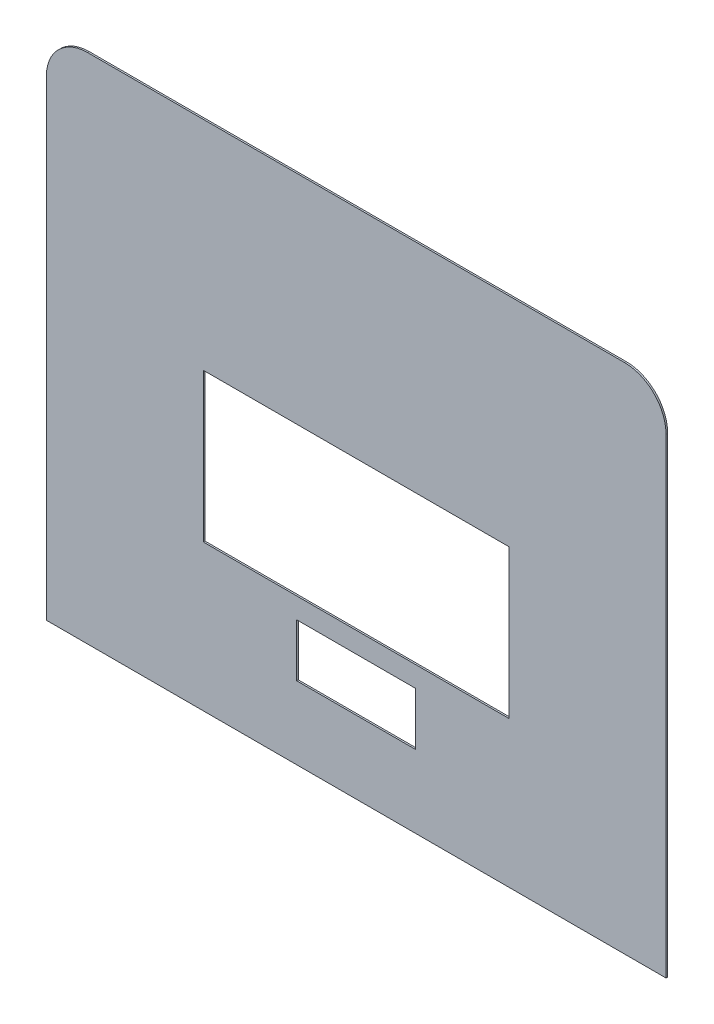
ISO-10303-21;
HEADER;
FILE_DESCRIPTION(('STEP AP214'),'2;1');
FILE_NAME('part.step','',(''),(''),'','','');
FILE_SCHEMA(('AUTOMOTIVE_DESIGN { 1 0 10303 214 1 1 1 1 }'));
ENDSEC;
DATA;
#1=APPLICATION_CONTEXT('core data for automotive mechanical design processes');
#2=APPLICATION_PROTOCOL_DEFINITION('international standard','automotive_design',2000,#1);
#3=PRODUCT_CONTEXT('',#1,'mechanical');
#4=PRODUCT('Part','Part','',(#3));
#5=PRODUCT_RELATED_PRODUCT_CATEGORY('part','',(#4));
#6=PRODUCT_DEFINITION_FORMATION('','',#4);
#7=PRODUCT_DEFINITION_CONTEXT('part definition',#1,'design');
#8=PRODUCT_DEFINITION('design','',#6,#7);
#9=PRODUCT_DEFINITION_SHAPE('','',#8);
#10=(LENGTH_UNIT() NAMED_UNIT(*) SI_UNIT(.MILLI.,.METRE.));
#11=(NAMED_UNIT(*) PLANE_ANGLE_UNIT() SI_UNIT($,.RADIAN.));
#12=(NAMED_UNIT(*) SI_UNIT($,.STERADIAN.) SOLID_ANGLE_UNIT());
#13=UNCERTAINTY_MEASURE_WITH_UNIT(LENGTH_MEASURE(1.E-05),#10,'distance_accuracy_value','');
#14=(GEOMETRIC_REPRESENTATION_CONTEXT(3) GLOBAL_UNCERTAINTY_ASSIGNED_CONTEXT((#13)) GLOBAL_UNIT_ASSIGNED_CONTEXT((#10,
#11,#12)) REPRESENTATION_CONTEXT('',''));
#15=CARTESIAN_POINT('',(0.,0.,0.));
#16=DIRECTION('',(0.,0.,1.));
#17=DIRECTION('',(1.,0.,0.));
#18=AXIS2_PLACEMENT_3D('',#15,#16,#17);
#19=CARTESIAN_POINT('',(-325.,260.,1.));
#20=DIRECTION('',(0.,0.,1.));
#21=DIRECTION('',(1.,0.,0.));
#22=AXIS2_PLACEMENT_3D('',#19,#20,#21);
#23=PLANE('',#22);
#24=DIRECTION('',(0.,1.,0.));
#25=VECTOR('',#24,1.);
#26=CARTESIAN_POINT('',(375.,260.,1.));
#27=LINE('',#26,#25);
#28=CARTESIAN_POINT('',(375.,-310.,1.));
#29=VERTEX_POINT('',#28);
#30=CARTESIAN_POINT('',(375.,260.,1.));
#31=VERTEX_POINT('',#30);
#32=EDGE_CURVE('E203',#29,#31,#27,.T.);
#33=ORIENTED_EDGE('',*,*,#32,.T.);
#34=CARTESIAN_POINT('',(325.,260.,1.));
#35=DIRECTION('',(0.,0.,1.));
#36=DIRECTION('',(-1.,0.,0.));
#37=AXIS2_PLACEMENT_3D('',#34,#35,#36);
#38=CIRCLE('',#37,50.);
#39=CARTESIAN_POINT('',(325.,310.,1.));
#40=VERTEX_POINT('',#39);
#41=EDGE_CURVE('E206',#31,#40,#38,.T.);
#42=ORIENTED_EDGE('',*,*,#41,.T.);
#43=DIRECTION('',(-1.,0.,0.));
#44=VECTOR('',#43,1.);
#45=CARTESIAN_POINT('',(-325.,310.,1.));
#46=LINE('',#45,#44);
#47=CARTESIAN_POINT('',(-325.,310.,1.));
#48=VERTEX_POINT('',#47);
#49=EDGE_CURVE('E209',#40,#48,#46,.T.);
#50=ORIENTED_EDGE('',*,*,#49,.T.);
#51=CARTESIAN_POINT('',(-325.,260.,1.));
#52=DIRECTION('',(0.,0.,1.));
#53=DIRECTION('',(1.,0.,0.));
#54=AXIS2_PLACEMENT_3D('',#51,#52,#53);
#55=CIRCLE('',#54,50.);
#56=CARTESIAN_POINT('',(-375.,260.,1.));
#57=VERTEX_POINT('',#56);
#58=EDGE_CURVE('E211',#48,#57,#55,.T.);
#59=ORIENTED_EDGE('',*,*,#58,.T.);
#60=DIRECTION('',(0.,-1.,0.));
#61=VECTOR('',#60,1.);
#62=CARTESIAN_POINT('',(-375.,260.,1.));
#63=LINE('',#62,#61);
#64=CARTESIAN_POINT('',(-375.,-310.,1.));
#65=VERTEX_POINT('',#64);
#66=EDGE_CURVE('E213',#57,#65,#63,.T.);
#67=ORIENTED_EDGE('',*,*,#66,.T.);
#68=DIRECTION('',(1.,0.,0.));
#69=VECTOR('',#68,1.);
#70=CARTESIAN_POINT('',(-375.,-310.,1.));
#71=LINE('',#70,#69);
#72=EDGE_CURVE('E215',#65,#29,#71,.T.);
#73=ORIENTED_EDGE('',*,*,#72,.T.);
#74=EDGE_LOOP('',(#33,#42,#50,#59,#67,#73));
#75=FACE_BOUND('',#74,.T.);
#76=DIRECTION('',(-1.,0.,0.));
#77=VECTOR('',#76,1.);
#78=CARTESIAN_POINT('',(-71.9999999999999,-158.,1.));
#79=LINE('',#78,#77);
#80=CARTESIAN_POINT('',(72.0000000000001,-158.,1.));
#81=VERTEX_POINT('',#80);
#82=CARTESIAN_POINT('',(-71.9999999999999,-158.,1.));
#83=VERTEX_POINT('',#82);
#84=EDGE_CURVE('E174',#81,#83,#79,.T.);
#85=ORIENTED_EDGE('',*,*,#84,.F.);
#86=DIRECTION('',(0.,1.,0.));
#87=VECTOR('',#86,1.);
#88=CARTESIAN_POINT('',(72.0000000000001,-158.,1.));
#89=LINE('',#88,#87);
#90=CARTESIAN_POINT('',(72.0000000000001,-222.,1.));
#91=VERTEX_POINT('',#90);
#92=EDGE_CURVE('E172',#91,#81,#89,.T.);
#93=ORIENTED_EDGE('',*,*,#92,.F.);
#94=DIRECTION('',(1.,0.,0.));
#95=VECTOR('',#94,1.);
#96=CARTESIAN_POINT('',(-71.9999999999999,-222.,1.));
#97=LINE('',#96,#95);
#98=CARTESIAN_POINT('',(-72.,-222.,1.));
#99=VERTEX_POINT('',#98);
#100=EDGE_CURVE('E180',#99,#91,#97,.T.);
#101=ORIENTED_EDGE('',*,*,#100,.F.);
#102=DIRECTION('',(0.,-1.,0.));
#103=VECTOR('',#102,1.);
#104=CARTESIAN_POINT('',(-71.9999999999999,-158.,1.));
#105=LINE('',#104,#103);
#106=EDGE_CURVE('E177',#83,#99,#105,.T.);
#107=ORIENTED_EDGE('',*,*,#106,.F.);
#108=EDGE_LOOP('',(#85,#93,#101,#107));
#109=FACE_BOUND('',#108,.T.);
#110=DIRECTION('',(-1.,0.,0.));
#111=VECTOR('',#110,1.);
#112=CARTESIAN_POINT('',(-185.,47.,1.));
#113=LINE('',#112,#111);
#114=CARTESIAN_POINT('',(185.,47.,1.));
#115=VERTEX_POINT('',#114);
#116=CARTESIAN_POINT('',(-185.,47.,1.));
#117=VERTEX_POINT('',#116);
#118=EDGE_CURVE('E144',#115,#117,#113,.T.);
#119=ORIENTED_EDGE('',*,*,#118,.F.);
#120=DIRECTION('',(0.,1.,0.));
#121=VECTOR('',#120,1.);
#122=CARTESIAN_POINT('',(185.,47.,1.));
#123=LINE('',#122,#121);
#124=CARTESIAN_POINT('',(185.,-133.,1.));
#125=VERTEX_POINT('',#124);
#126=EDGE_CURVE('E136',#125,#115,#123,.T.);
#127=ORIENTED_EDGE('',*,*,#126,.F.);
#128=DIRECTION('',(1.,0.,0.));
#129=VECTOR('',#128,1.);
#130=CARTESIAN_POINT('',(-185.,-133.,1.));
#131=LINE('',#130,#129);
#132=CARTESIAN_POINT('',(-185.,-133.,1.));
#133=VERTEX_POINT('',#132);
#134=EDGE_CURVE('E158',#133,#125,#131,.T.);
#135=ORIENTED_EDGE('',*,*,#134,.F.);
#136=DIRECTION('',(0.,-1.,0.));
#137=VECTOR('',#136,1.);
#138=CARTESIAN_POINT('',(-185.,47.,1.));
#139=LINE('',#138,#137);
#140=EDGE_CURVE('E156',#117,#133,#139,.T.);
#141=ORIENTED_EDGE('',*,*,#140,.F.);
#142=EDGE_LOOP('',(#119,#127,#135,#141));
#143=FACE_BOUND('',#142,.T.);
#144=ADVANCED_FACE('F35',(#75,#109,#143),#23,.T.);
#145=CARTESIAN_POINT('',(-325.,260.,-1.));
#146=DIRECTION('',(0.,0.,1.));
#147=DIRECTION('',(1.,0.,0.));
#148=AXIS2_PLACEMENT_3D('',#145,#146,#147);
#149=PLANE('',#148);
#150=DIRECTION('',(0.,1.,0.));
#151=VECTOR('',#150,1.);
#152=CARTESIAN_POINT('',(72.0000000000001,-158.,-1.));
#153=LINE('',#152,#151);
#154=CARTESIAN_POINT('',(72.0000000000001,-222.,-1.));
#155=VERTEX_POINT('',#154);
#156=CARTESIAN_POINT('',(72.0000000000001,-158.,-1.));
#157=VERTEX_POINT('',#156);
#158=EDGE_CURVE('E152',#155,#157,#153,.T.);
#159=ORIENTED_EDGE('',*,*,#158,.T.);
#160=DIRECTION('',(-1.,0.,0.));
#161=VECTOR('',#160,1.);
#162=CARTESIAN_POINT('',(-71.9999999999999,-158.,-1.));
#163=LINE('',#162,#161);
#164=CARTESIAN_POINT('',(-71.9999999999999,-158.,-1.));
#165=VERTEX_POINT('',#164);
#166=EDGE_CURVE('E185',#157,#165,#163,.T.);
#167=ORIENTED_EDGE('',*,*,#166,.T.);
#168=DIRECTION('',(0.,-1.,0.));
#169=VECTOR('',#168,1.);
#170=CARTESIAN_POINT('',(-71.9999999999999,-158.,-1.));
#171=LINE('',#170,#169);
#172=CARTESIAN_POINT('',(-71.9999999999999,-222.,-1.));
#173=VERTEX_POINT('',#172);
#174=EDGE_CURVE('E188',#165,#173,#171,.T.);
#175=ORIENTED_EDGE('',*,*,#174,.T.);
#176=DIRECTION('',(1.,0.,0.));
#177=VECTOR('',#176,1.);
#178=CARTESIAN_POINT('',(-71.9999999999999,-222.,-1.));
#179=LINE('',#178,#177);
#180=EDGE_CURVE('E175',#173,#155,#179,.T.);
#181=ORIENTED_EDGE('',*,*,#180,.T.);
#182=EDGE_LOOP('',(#159,#167,#175,#181));
#183=FACE_BOUND('',#182,.T.);
#184=DIRECTION('',(0.,1.,0.));
#185=VECTOR('',#184,1.);
#186=CARTESIAN_POINT('',(375.,260.,-1.));
#187=LINE('',#186,#185);
#188=CARTESIAN_POINT('',(375.,-310.,-1.));
#189=VERTEX_POINT('',#188);
#190=CARTESIAN_POINT('',(375.,260.,-1.));
#191=VERTEX_POINT('',#190);
#192=EDGE_CURVE('E202',#189,#191,#187,.T.);
#193=ORIENTED_EDGE('',*,*,#192,.F.);
#194=DIRECTION('',(1.,0.,0.));
#195=VECTOR('',#194,1.);
#196=CARTESIAN_POINT('',(-375.,-310.,-1.));
#197=LINE('',#196,#195);
#198=CARTESIAN_POINT('',(-375.,-310.,-1.));
#199=VERTEX_POINT('',#198);
#200=EDGE_CURVE('E207',#199,#189,#197,.T.);
#201=ORIENTED_EDGE('',*,*,#200,.F.);
#202=DIRECTION('',(0.,-1.,0.));
#203=VECTOR('',#202,1.);
#204=CARTESIAN_POINT('',(-375.,260.,-1.));
#205=LINE('',#204,#203);
#206=CARTESIAN_POINT('',(-375.,260.,-1.));
#207=VERTEX_POINT('',#206);
#208=EDGE_CURVE('E226',#207,#199,#205,.T.);
#209=ORIENTED_EDGE('',*,*,#208,.F.);
#210=CARTESIAN_POINT('',(-325.,260.,-1.));
#211=DIRECTION('',(0.,0.,1.));
#212=DIRECTION('',(1.,0.,0.));
#213=AXIS2_PLACEMENT_3D('',#210,#211,#212);
#214=CIRCLE('',#213,50.);
#215=CARTESIAN_POINT('',(-325.,310.,-1.));
#216=VERTEX_POINT('',#215);
#217=EDGE_CURVE('E224',#216,#207,#214,.T.);
#218=ORIENTED_EDGE('',*,*,#217,.F.);
#219=DIRECTION('',(-1.,0.,0.));
#220=VECTOR('',#219,1.);
#221=CARTESIAN_POINT('',(-325.,310.,-1.));
#222=LINE('',#221,#220);
#223=CARTESIAN_POINT('',(325.,310.,-1.));
#224=VERTEX_POINT('',#223);
#225=EDGE_CURVE('E222',#224,#216,#222,.T.);
#226=ORIENTED_EDGE('',*,*,#225,.F.);
#227=CARTESIAN_POINT('',(325.,260.,-1.));
#228=DIRECTION('',(0.,0.,1.));
#229=DIRECTION('',(-1.,0.,0.));
#230=AXIS2_PLACEMENT_3D('',#227,#228,#229);
#231=CIRCLE('',#230,50.);
#232=EDGE_CURVE('E220',#191,#224,#231,.T.);
#233=ORIENTED_EDGE('',*,*,#232,.F.);
#234=EDGE_LOOP('',(#193,#201,#209,#218,#226,#233));
#235=FACE_BOUND('',#234,.T.);
#236=DIRECTION('',(0.,1.,0.));
#237=VECTOR('',#236,1.);
#238=CARTESIAN_POINT('',(185.,47.,-1.));
#239=LINE('',#238,#237);
#240=CARTESIAN_POINT('',(185.,-133.,-1.));
#241=VERTEX_POINT('',#240);
#242=CARTESIAN_POINT('',(185.,47.,-1.));
#243=VERTEX_POINT('',#242);
#244=EDGE_CURVE('E58',#241,#243,#239,.T.);
#245=ORIENTED_EDGE('',*,*,#244,.T.);
#246=DIRECTION('',(-1.,0.,0.));
#247=VECTOR('',#246,1.);
#248=CARTESIAN_POINT('',(-185.,47.,-1.));
#249=LINE('',#248,#247);
#250=CARTESIAN_POINT('',(-185.,47.,-1.));
#251=VERTEX_POINT('',#250);
#252=EDGE_CURVE('E151',#243,#251,#249,.T.);
#253=ORIENTED_EDGE('',*,*,#252,.T.);
#254=DIRECTION('',(0.,-1.,0.));
#255=VECTOR('',#254,1.);
#256=CARTESIAN_POINT('',(-185.,47.,-1.));
#257=LINE('',#256,#255);
#258=CARTESIAN_POINT('',(-185.,-133.,-1.));
#259=VERTEX_POINT('',#258);
#260=EDGE_CURVE('E164',#251,#259,#257,.T.);
#261=ORIENTED_EDGE('',*,*,#260,.T.);
#262=DIRECTION('',(1.,0.,0.));
#263=VECTOR('',#262,1.);
#264=CARTESIAN_POINT('',(-185.,-133.,-1.));
#265=LINE('',#264,#263);
#266=EDGE_CURVE('E145',#259,#241,#265,.T.);
#267=ORIENTED_EDGE('',*,*,#266,.T.);
#268=EDGE_LOOP('',(#245,#253,#261,#267));
#269=FACE_BOUND('',#268,.T.);
#270=ADVANCED_FACE('F250',(#183,#235,#269),#149,.F.);
#271=CARTESIAN_POINT('',(375.,260.,1.));
#272=DIRECTION('',(-1.,0.,0.));
#273=DIRECTION('',(0.,-1.,0.));
#274=AXIS2_PLACEMENT_3D('',#271,#272,#273);
#275=PLANE('',#274);
#276=ORIENTED_EDGE('',*,*,#192,.T.);
#277=DIRECTION('',(0.,0.,-1.));
#278=VECTOR('',#277,1.);
#279=CARTESIAN_POINT('',(375.,260.,1.));
#280=LINE('',#279,#278);
#281=EDGE_CURVE('E11',#31,#191,#280,.T.);
#282=ORIENTED_EDGE('',*,*,#281,.F.);
#283=ORIENTED_EDGE('',*,*,#32,.F.);
#284=DIRECTION('',(0.,0.,-1.));
#285=VECTOR('',#284,1.);
#286=CARTESIAN_POINT('',(375.,-310.,1.));
#287=LINE('',#286,#285);
#288=EDGE_CURVE('E217',#29,#189,#287,.T.);
#289=ORIENTED_EDGE('',*,*,#288,.T.);
#290=EDGE_LOOP('',(#276,#282,#283,#289));
#291=FACE_BOUND('',#290,.T.);
#292=ADVANCED_FACE('F37',(#291),#275,.F.);
#293=CARTESIAN_POINT('',(325.,260.,1.));
#294=DIRECTION('',(0.,0.,-1.));
#295=DIRECTION('',(-1.,0.,0.));
#296=AXIS2_PLACEMENT_3D('',#293,#294,#295);
#297=CYLINDRICAL_SURFACE('',#296,50.);
#298=ORIENTED_EDGE('',*,*,#232,.T.);
#299=DIRECTION('',(0.,0.,-1.));
#300=VECTOR('',#299,1.);
#301=CARTESIAN_POINT('',(325.,310.,1.));
#302=LINE('',#301,#300);
#303=EDGE_CURVE('E43',#40,#224,#302,.T.);
#304=ORIENTED_EDGE('',*,*,#303,.F.);
#305=ORIENTED_EDGE('',*,*,#41,.F.);
#306=ORIENTED_EDGE('',*,*,#281,.T.);
#307=EDGE_LOOP('',(#298,#304,#305,#306));
#308=FACE_BOUND('',#307,.T.);
#309=ADVANCED_FACE('F268',(#308),#297,.T.);
#310=CARTESIAN_POINT('',(-325.,310.,1.));
#311=DIRECTION('',(0.,-1.,0.));
#312=DIRECTION('',(0.,0.,-1.));
#313=AXIS2_PLACEMENT_3D('',#310,#311,#312);
#314=PLANE('',#313);
#315=ORIENTED_EDGE('',*,*,#225,.T.);
#316=DIRECTION('',(0.,0.,-1.));
#317=VECTOR('',#316,1.);
#318=CARTESIAN_POINT('',(-325.,310.,1.));
#319=LINE('',#318,#317);
#320=EDGE_CURVE('E237',#48,#216,#319,.T.);
#321=ORIENTED_EDGE('',*,*,#320,.F.);
#322=ORIENTED_EDGE('',*,*,#49,.F.);
#323=ORIENTED_EDGE('',*,*,#303,.T.);
#324=EDGE_LOOP('',(#315,#321,#322,#323));
#325=FACE_BOUND('',#324,.T.);
#326=ADVANCED_FACE('F244',(#325),#314,.F.);
#327=CARTESIAN_POINT('',(-325.,260.,1.));
#328=DIRECTION('',(0.,0.,-1.));
#329=DIRECTION('',(-1.,0.,0.));
#330=AXIS2_PLACEMENT_3D('',#327,#328,#329);
#331=CYLINDRICAL_SURFACE('',#330,50.);
#332=ORIENTED_EDGE('',*,*,#217,.T.);
#333=DIRECTION('',(0.,0.,-1.));
#334=VECTOR('',#333,1.);
#335=CARTESIAN_POINT('',(-375.,260.,1.));
#336=LINE('',#335,#334);
#337=EDGE_CURVE('E234',#57,#207,#336,.T.);
#338=ORIENTED_EDGE('',*,*,#337,.F.);
#339=ORIENTED_EDGE('',*,*,#58,.F.);
#340=ORIENTED_EDGE('',*,*,#320,.T.);
#341=EDGE_LOOP('',(#332,#338,#339,#340));
#342=FACE_BOUND('',#341,.T.);
#343=ADVANCED_FACE('F256',(#342),#331,.T.);
#344=CARTESIAN_POINT('',(-375.,260.,1.));
#345=DIRECTION('',(1.,0.,0.));
#346=DIRECTION('',(0.,0.,-1.));
#347=AXIS2_PLACEMENT_3D('',#344,#345,#346);
#348=PLANE('',#347);
#349=ORIENTED_EDGE('',*,*,#208,.T.);
#350=DIRECTION('',(0.,0.,-1.));
#351=VECTOR('',#350,1.);
#352=CARTESIAN_POINT('',(-375.,-310.,1.));
#353=LINE('',#352,#351);
#354=EDGE_CURVE('E231',#65,#199,#353,.T.);
#355=ORIENTED_EDGE('',*,*,#354,.F.);
#356=ORIENTED_EDGE('',*,*,#66,.F.);
#357=ORIENTED_EDGE('',*,*,#337,.T.);
#358=EDGE_LOOP('',(#349,#355,#356,#357));
#359=FACE_BOUND('',#358,.T.);
#360=ADVANCED_FACE('F260',(#359),#348,.F.);
#361=CARTESIAN_POINT('',(-375.,-310.,1.));
#362=DIRECTION('',(0.,1.,0.));
#363=DIRECTION('',(0.,0.,1.));
#364=AXIS2_PLACEMENT_3D('',#361,#362,#363);
#365=PLANE('',#364);
#366=ORIENTED_EDGE('',*,*,#200,.T.);
#367=ORIENTED_EDGE('',*,*,#288,.F.);
#368=ORIENTED_EDGE('',*,*,#72,.F.);
#369=ORIENTED_EDGE('',*,*,#354,.T.);
#370=EDGE_LOOP('',(#366,#367,#368,#369));
#371=FACE_BOUND('',#370,.T.);
#372=ADVANCED_FACE('F271',(#371),#365,.F.);
#373=CARTESIAN_POINT('',(72.0000000000001,-158.,1.));
#374=DIRECTION('',(-1.,0.,0.));
#375=DIRECTION('',(0.,-1.,0.));
#376=AXIS2_PLACEMENT_3D('',#373,#374,#375);
#377=PLANE('',#376);
#378=ORIENTED_EDGE('',*,*,#158,.F.);
#379=DIRECTION('',(0.,0.,-1.));
#380=VECTOR('',#379,1.);
#381=CARTESIAN_POINT('',(72.0000000000001,-222.,1.));
#382=LINE('',#381,#380);
#383=EDGE_CURVE('E182',#91,#155,#382,.T.);
#384=ORIENTED_EDGE('',*,*,#383,.F.);
#385=ORIENTED_EDGE('',*,*,#92,.T.);
#386=DIRECTION('',(0.,0.,-1.));
#387=VECTOR('',#386,1.);
#388=CARTESIAN_POINT('',(72.0000000000001,-158.,1.));
#389=LINE('',#388,#387);
#390=EDGE_CURVE('E199',#81,#157,#389,.T.);
#391=ORIENTED_EDGE('',*,*,#390,.T.);
#392=EDGE_LOOP('',(#378,#384,#385,#391));
#393=FACE_BOUND('',#392,.T.);
#394=ADVANCED_FACE('F273',(#393),#377,.T.);
#395=CARTESIAN_POINT('',(-71.9999999999999,-158.,1.));
#396=DIRECTION('',(0.,-1.,0.));
#397=DIRECTION('',(0.,0.,-1.));
#398=AXIS2_PLACEMENT_3D('',#395,#396,#397);
#399=PLANE('',#398);
#400=ORIENTED_EDGE('',*,*,#166,.F.);
#401=ORIENTED_EDGE('',*,*,#390,.F.);
#402=ORIENTED_EDGE('',*,*,#84,.T.);
#403=DIRECTION('',(0.,0.,-1.));
#404=VECTOR('',#403,1.);
#405=CARTESIAN_POINT('',(-71.9999999999999,-158.,1.));
#406=LINE('',#405,#404);
#407=EDGE_CURVE('E197',#83,#165,#406,.T.);
#408=ORIENTED_EDGE('',*,*,#407,.T.);
#409=EDGE_LOOP('',(#400,#401,#402,#408));
#410=FACE_BOUND('',#409,.T.);
#411=ADVANCED_FACE('F279',(#410),#399,.T.);
#412=CARTESIAN_POINT('',(-71.9999999999999,-158.,1.));
#413=DIRECTION('',(1.,0.,0.));
#414=DIRECTION('',(0.,1.,0.));
#415=AXIS2_PLACEMENT_3D('',#412,#413,#414);
#416=PLANE('',#415);
#417=ORIENTED_EDGE('',*,*,#174,.F.);
#418=ORIENTED_EDGE('',*,*,#407,.F.);
#419=ORIENTED_EDGE('',*,*,#106,.T.);
#420=DIRECTION('',(0.,0.,-1.));
#421=VECTOR('',#420,1.);
#422=CARTESIAN_POINT('',(-71.9999999999999,-222.,1.));
#423=LINE('',#422,#421);
#424=EDGE_CURVE('E195',#99,#173,#423,.T.);
#425=ORIENTED_EDGE('',*,*,#424,.T.);
#426=EDGE_LOOP('',(#417,#418,#419,#425));
#427=FACE_BOUND('',#426,.T.);
#428=ADVANCED_FACE('F293',(#427),#416,.T.);
#429=CARTESIAN_POINT('',(-71.9999999999999,-222.,1.));
#430=DIRECTION('',(0.,1.,0.));
#431=DIRECTION('',(0.,0.,1.));
#432=AXIS2_PLACEMENT_3D('',#429,#430,#431);
#433=PLANE('',#432);
#434=ORIENTED_EDGE('',*,*,#180,.F.);
#435=ORIENTED_EDGE('',*,*,#424,.F.);
#436=ORIENTED_EDGE('',*,*,#100,.T.);
#437=ORIENTED_EDGE('',*,*,#383,.T.);
#438=EDGE_LOOP('',(#434,#435,#436,#437));
#439=FACE_BOUND('',#438,.T.);
#440=ADVANCED_FACE('F297',(#439),#433,.T.);
#441=CARTESIAN_POINT('',(185.,47.,1.));
#442=DIRECTION('',(-1.,0.,0.));
#443=DIRECTION('',(0.,-1.,0.));
#444=AXIS2_PLACEMENT_3D('',#441,#442,#443);
#445=PLANE('',#444);
#446=ORIENTED_EDGE('',*,*,#244,.F.);
#447=DIRECTION('',(0.,0.,-1.));
#448=VECTOR('',#447,1.);
#449=CARTESIAN_POINT('',(185.,-133.,1.));
#450=LINE('',#449,#448);
#451=EDGE_CURVE('E140',#125,#241,#450,.T.);
#452=ORIENTED_EDGE('',*,*,#451,.F.);
#453=ORIENTED_EDGE('',*,*,#126,.T.);
#454=DIRECTION('',(0.,0.,-1.));
#455=VECTOR('',#454,1.);
#456=CARTESIAN_POINT('',(185.,47.,1.));
#457=LINE('',#456,#455);
#458=EDGE_CURVE('E139',#115,#243,#457,.T.);
#459=ORIENTED_EDGE('',*,*,#458,.T.);
#460=EDGE_LOOP('',(#446,#452,#453,#459));
#461=FACE_BOUND('',#460,.T.);
#462=ADVANCED_FACE('F138',(#461),#445,.T.);
#463=CARTESIAN_POINT('',(-185.,47.,1.));
#464=DIRECTION('',(0.,-1.,0.));
#465=DIRECTION('',(1.,0.,0.));
#466=AXIS2_PLACEMENT_3D('',#463,#464,#465);
#467=PLANE('',#466);
#468=ORIENTED_EDGE('',*,*,#252,.F.);
#469=ORIENTED_EDGE('',*,*,#458,.F.);
#470=ORIENTED_EDGE('',*,*,#118,.T.);
#471=DIRECTION('',(0.,0.,-1.));
#472=VECTOR('',#471,1.);
#473=CARTESIAN_POINT('',(-185.,47.,1.));
#474=LINE('',#473,#472);
#475=EDGE_CURVE('E153',#117,#251,#474,.T.);
#476=ORIENTED_EDGE('',*,*,#475,.T.);
#477=EDGE_LOOP('',(#468,#469,#470,#476));
#478=FACE_BOUND('',#477,.T.);
#479=ADVANCED_FACE('F148',(#478),#467,.T.);
#480=CARTESIAN_POINT('',(-185.,47.,1.));
#481=DIRECTION('',(1.,0.,0.));
#482=DIRECTION('',(0.,1.,0.));
#483=AXIS2_PLACEMENT_3D('',#480,#481,#482);
#484=PLANE('',#483);
#485=ORIENTED_EDGE('',*,*,#260,.F.);
#486=ORIENTED_EDGE('',*,*,#475,.F.);
#487=ORIENTED_EDGE('',*,*,#140,.T.);
#488=DIRECTION('',(0.,0.,-1.));
#489=VECTOR('',#488,1.);
#490=CARTESIAN_POINT('',(-185.,-133.,1.));
#491=LINE('',#490,#489);
#492=EDGE_CURVE('E50',#133,#259,#491,.T.);
#493=ORIENTED_EDGE('',*,*,#492,.T.);
#494=EDGE_LOOP('',(#485,#486,#487,#493));
#495=FACE_BOUND('',#494,.T.);
#496=ADVANCED_FACE('F306',(#495),#484,.T.);
#497=CARTESIAN_POINT('',(-185.,-133.,1.));
#498=DIRECTION('',(0.,1.,0.));
#499=DIRECTION('',(0.,0.,1.));
#500=AXIS2_PLACEMENT_3D('',#497,#498,#499);
#501=PLANE('',#500);
#502=ORIENTED_EDGE('',*,*,#266,.F.);
#503=ORIENTED_EDGE('',*,*,#492,.F.);
#504=ORIENTED_EDGE('',*,*,#134,.T.);
#505=ORIENTED_EDGE('',*,*,#451,.T.);
#506=EDGE_LOOP('',(#502,#503,#504,#505));
#507=FACE_BOUND('',#506,.T.);
#508=ADVANCED_FACE('F309',(#507),#501,.T.);
#509=CLOSED_SHELL('',(#144,#270,#292,#309,#326,#343,#360,#372,#394,#411,#428,#440,#462,#479,
#496,#508));
#510=MANIFOLD_SOLID_BREP('B2',#509);
#511=ADVANCED_BREP_SHAPE_REPRESENTATION('',(#18,#510),#14);
#512=SHAPE_DEFINITION_REPRESENTATION(#9,#511);
ENDSEC;
END-ISO-10303-21;
